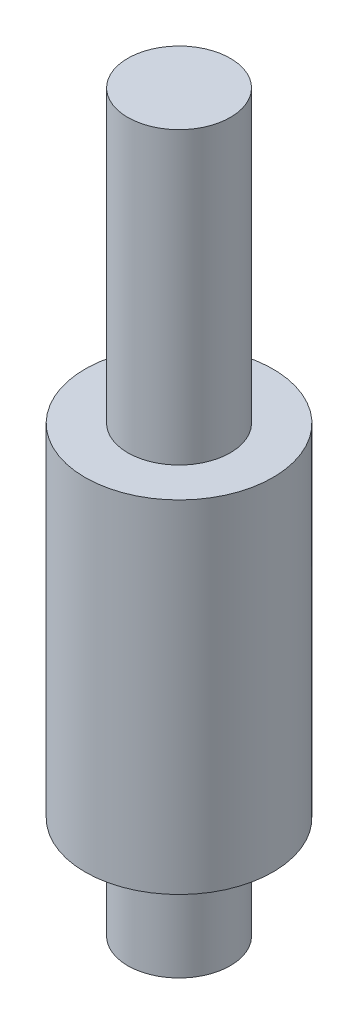
ISO-10303-21;
HEADER;
FILE_DESCRIPTION(('STEP AP214'),'2;1');
FILE_NAME('part.step','',(''),(''),'','','');
FILE_SCHEMA(('AUTOMOTIVE_DESIGN { 1 0 10303 214 1 1 1 1 }'));
ENDSEC;
DATA;
#1=APPLICATION_CONTEXT('core data for automotive mechanical design processes');
#2=APPLICATION_PROTOCOL_DEFINITION('international standard','automotive_design',2000,#1);
#3=PRODUCT_CONTEXT('',#1,'mechanical');
#4=PRODUCT('Part','Part','',(#3));
#5=PRODUCT_RELATED_PRODUCT_CATEGORY('part','',(#4));
#6=PRODUCT_DEFINITION_FORMATION('','',#4);
#7=PRODUCT_DEFINITION_CONTEXT('part definition',#1,'design');
#8=PRODUCT_DEFINITION('design','',#6,#7);
#9=PRODUCT_DEFINITION_SHAPE('','',#8);
#10=(LENGTH_UNIT() NAMED_UNIT(*) SI_UNIT(.MILLI.,.METRE.));
#11=(NAMED_UNIT(*) PLANE_ANGLE_UNIT() SI_UNIT($,.RADIAN.));
#12=(NAMED_UNIT(*) SI_UNIT($,.STERADIAN.) SOLID_ANGLE_UNIT());
#13=UNCERTAINTY_MEASURE_WITH_UNIT(LENGTH_MEASURE(1.E-05),#10,'distance_accuracy_value','');
#14=(GEOMETRIC_REPRESENTATION_CONTEXT(3) GLOBAL_UNCERTAINTY_ASSIGNED_CONTEXT((#13)) GLOBAL_UNIT_ASSIGNED_CONTEXT((#10,
#11,#12)) REPRESENTATION_CONTEXT('',''));
#15=CARTESIAN_POINT('',(0.,0.,0.));
#16=DIRECTION('',(0.,0.,1.));
#17=DIRECTION('',(1.,0.,0.));
#18=AXIS2_PLACEMENT_3D('',#15,#16,#17);
#19=CARTESIAN_POINT('',(0.,26.,0.));
#20=DIRECTION('',(0.,1.,0.));
#21=DIRECTION('',(0.,0.,1.));
#22=AXIS2_PLACEMENT_3D('',#19,#20,#21);
#23=PLANE('',#22);
#24=CARTESIAN_POINT('',(0.,26.,0.));
#25=DIRECTION('',(0.,1.,0.));
#26=DIRECTION('',(0.,0.,1.));
#27=AXIS2_PLACEMENT_3D('',#24,#25,#26);
#28=CIRCLE('',#27,5.5);
#29=CARTESIAN_POINT('',(0.,26.,5.5));
#30=VERTEX_POINT('',#29);
#31=EDGE_CURVE('E51',#30,#30,#28,.T.);
#32=ORIENTED_EDGE('',*,*,#31,.T.);
#33=EDGE_LOOP('',(#32));
#34=FACE_BOUND('',#33,.T.);
#35=CARTESIAN_POINT('',(0.,26.,0.));
#36=DIRECTION('',(0.,1.,0.));
#37=DIRECTION('',(0.,0.,1.));
#38=AXIS2_PLACEMENT_3D('',#35,#36,#37);
#39=CIRCLE('',#38,3.);
#40=CARTESIAN_POINT('',(0.,26.,3.));
#41=VERTEX_POINT('',#40);
#42=EDGE_CURVE('E59',#41,#41,#39,.T.);
#43=ORIENTED_EDGE('',*,*,#42,.F.);
#44=EDGE_LOOP('',(#43));
#45=FACE_BOUND('',#44,.T.);
#46=ADVANCED_FACE('F40',(#34,#45),#23,.T.);
#47=CARTESIAN_POINT('',(0.,6.,0.));
#48=DIRECTION('',(0.,-1.,0.));
#49=DIRECTION('',(0.,0.,-1.));
#50=AXIS2_PLACEMENT_3D('',#47,#48,#49);
#51=CYLINDRICAL_SURFACE('',#50,3.);
#52=CARTESIAN_POINT('',(0.,6.,0.));
#53=DIRECTION('',(0.,1.,0.));
#54=DIRECTION('',(0.,0.,1.));
#55=AXIS2_PLACEMENT_3D('',#52,#53,#54);
#56=CIRCLE('',#55,3.);
#57=CARTESIAN_POINT('',(0.,6.,3.));
#58=VERTEX_POINT('',#57);
#59=EDGE_CURVE('E10',#58,#58,#56,.T.);
#60=ORIENTED_EDGE('',*,*,#59,.F.);
#61=EDGE_LOOP('',(#60));
#62=FACE_BOUND('',#61,.T.);
#63=CARTESIAN_POINT('',(0.,0.,0.));
#64=DIRECTION('',(0.,1.,0.));
#65=DIRECTION('',(0.,0.,1.));
#66=AXIS2_PLACEMENT_3D('',#63,#64,#65);
#67=CIRCLE('',#66,3.);
#68=CARTESIAN_POINT('',(0.,0.,3.));
#69=VERTEX_POINT('',#68);
#70=EDGE_CURVE('E44',#69,#69,#67,.T.);
#71=ORIENTED_EDGE('',*,*,#70,.T.);
#72=EDGE_LOOP('',(#71));
#73=FACE_BOUND('',#72,.T.);
#74=ADVANCED_FACE('F42',(#62,#73),#51,.T.);
#75=CARTESIAN_POINT('',(0.,0.,0.));
#76=DIRECTION('',(0.,1.,0.));
#77=DIRECTION('',(0.,0.,1.));
#78=AXIS2_PLACEMENT_3D('',#75,#76,#77);
#79=PLANE('',#78);
#80=ORIENTED_EDGE('',*,*,#70,.F.);
#81=EDGE_LOOP('',(#80));
#82=FACE_BOUND('',#81,.T.);
#83=ADVANCED_FACE('F80',(#82),#79,.F.);
#84=CARTESIAN_POINT('',(0.,6.,0.));
#85=DIRECTION('',(0.,1.,0.));
#86=DIRECTION('',(0.,0.,1.));
#87=AXIS2_PLACEMENT_3D('',#84,#85,#86);
#88=PLANE('',#87);
#89=CARTESIAN_POINT('',(0.,6.,0.));
#90=DIRECTION('',(0.,1.,0.));
#91=DIRECTION('',(0.,0.,1.));
#92=AXIS2_PLACEMENT_3D('',#89,#90,#91);
#93=CIRCLE('',#92,5.5);
#94=CARTESIAN_POINT('',(0.,6.,5.5));
#95=VERTEX_POINT('',#94);
#96=EDGE_CURVE('E53',#95,#95,#93,.T.);
#97=ORIENTED_EDGE('',*,*,#96,.F.);
#98=EDGE_LOOP('',(#97));
#99=FACE_BOUND('',#98,.T.);
#100=ORIENTED_EDGE('',*,*,#59,.T.);
#101=EDGE_LOOP('',(#100));
#102=FACE_BOUND('',#101,.T.);
#103=ADVANCED_FACE('F84',(#99,#102),#88,.F.);
#104=CARTESIAN_POINT('',(0.,26.,0.));
#105=DIRECTION('',(0.,-1.,0.));
#106=DIRECTION('',(0.,0.,-1.));
#107=AXIS2_PLACEMENT_3D('',#104,#105,#106);
#108=CYLINDRICAL_SURFACE('',#107,5.5);
#109=ORIENTED_EDGE('',*,*,#31,.F.);
#110=EDGE_LOOP('',(#109));
#111=FACE_BOUND('',#110,.T.);
#112=ORIENTED_EDGE('',*,*,#96,.T.);
#113=EDGE_LOOP('',(#112));
#114=FACE_BOUND('',#113,.T.);
#115=ADVANCED_FACE('F70',(#111,#114),#108,.T.);
#116=CARTESIAN_POINT('',(0.,43.,0.));
#117=DIRECTION('',(0.,-1.,0.));
#118=DIRECTION('',(0.,0.,-1.));
#119=AXIS2_PLACEMENT_3D('',#116,#117,#118);
#120=CYLINDRICAL_SURFACE('',#119,3.);
#121=CARTESIAN_POINT('',(0.,43.,0.));
#122=DIRECTION('',(0.,1.,0.));
#123=DIRECTION('',(0.,0.,1.));
#124=AXIS2_PLACEMENT_3D('',#121,#122,#123);
#125=CIRCLE('',#124,3.);
#126=CARTESIAN_POINT('',(0.,43.,3.));
#127=VERTEX_POINT('',#126);
#128=EDGE_CURVE('E56',#127,#127,#125,.T.);
#129=ORIENTED_EDGE('',*,*,#128,.F.);
#130=EDGE_LOOP('',(#129));
#131=FACE_BOUND('',#130,.T.);
#132=ORIENTED_EDGE('',*,*,#42,.T.);
#133=EDGE_LOOP('',(#132));
#134=FACE_BOUND('',#133,.T.);
#135=ADVANCED_FACE('F67',(#131,#134),#120,.T.);
#136=CARTESIAN_POINT('',(0.,43.,0.));
#137=DIRECTION('',(0.,1.,0.));
#138=DIRECTION('',(0.,0.,1.));
#139=AXIS2_PLACEMENT_3D('',#136,#137,#138);
#140=PLANE('',#139);
#141=ORIENTED_EDGE('',*,*,#128,.T.);
#142=EDGE_LOOP('',(#141));
#143=FACE_BOUND('',#142,.T.);
#144=ADVANCED_FACE('F65',(#143),#140,.T.);
#145=CLOSED_SHELL('',(#46,#74,#83,#103,#115,#135,#144));
#146=MANIFOLD_SOLID_BREP('B2',#145);
#147=ADVANCED_BREP_SHAPE_REPRESENTATION('',(#18,#146),#14);
#148=SHAPE_DEFINITION_REPRESENTATION(#9,#147);
ENDSEC;
END-ISO-10303-21;
